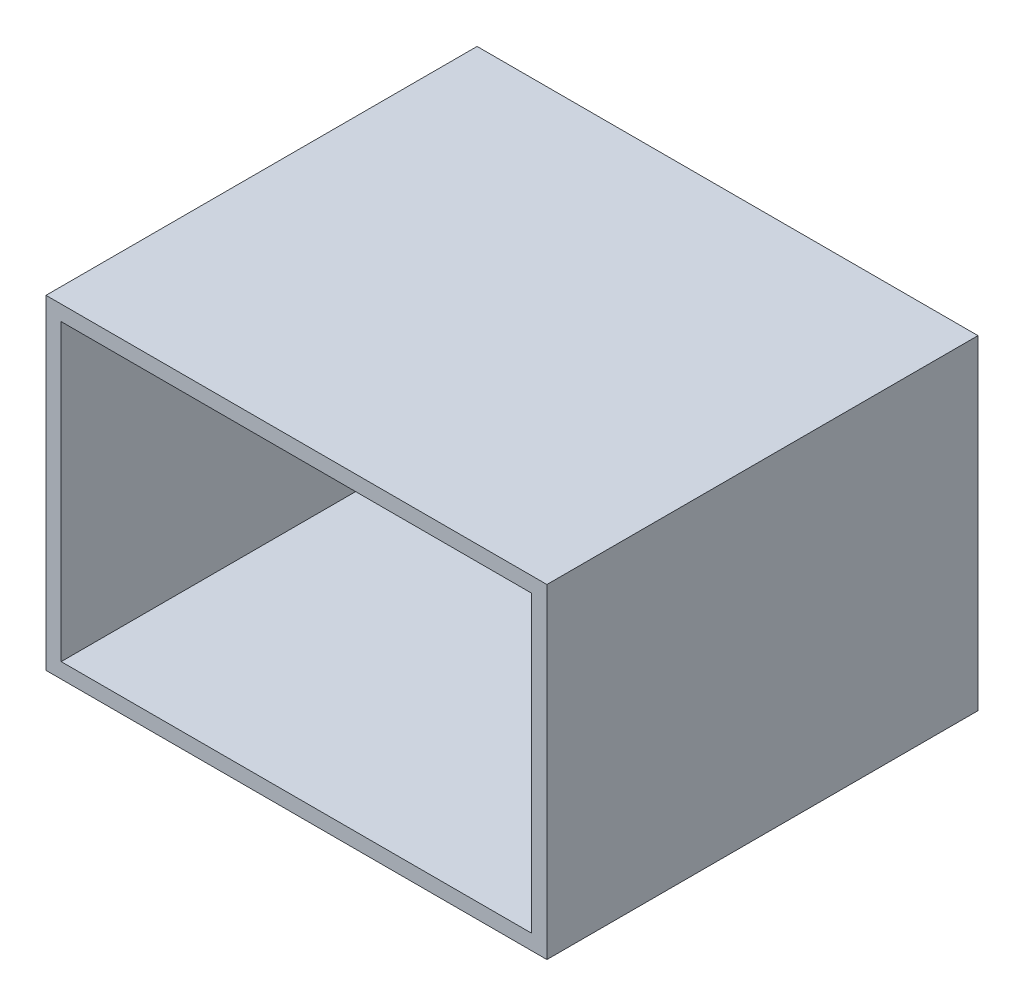
ISO-10303-21;
HEADER;
FILE_DESCRIPTION(('STEP AP214'),'2;1');
FILE_NAME('part.step','',(''),(''),'','','');
FILE_SCHEMA(('AUTOMOTIVE_DESIGN { 1 0 10303 214 1 1 1 1 }'));
ENDSEC;
DATA;
#1=APPLICATION_CONTEXT('core data for automotive mechanical design processes');
#2=APPLICATION_PROTOCOL_DEFINITION('international standard','automotive_design',2000,#1);
#3=PRODUCT_CONTEXT('',#1,'mechanical');
#4=PRODUCT('Part','Part','',(#3));
#5=PRODUCT_RELATED_PRODUCT_CATEGORY('part','',(#4));
#6=PRODUCT_DEFINITION_FORMATION('','',#4);
#7=PRODUCT_DEFINITION_CONTEXT('part definition',#1,'design');
#8=PRODUCT_DEFINITION('design','',#6,#7);
#9=PRODUCT_DEFINITION_SHAPE('','',#8);
#10=(LENGTH_UNIT() NAMED_UNIT(*) SI_UNIT(.MILLI.,.METRE.));
#11=(NAMED_UNIT(*) PLANE_ANGLE_UNIT() SI_UNIT($,.RADIAN.));
#12=(NAMED_UNIT(*) SI_UNIT($,.STERADIAN.) SOLID_ANGLE_UNIT());
#13=UNCERTAINTY_MEASURE_WITH_UNIT(LENGTH_MEASURE(1.E-05),#10,'distance_accuracy_value','');
#14=(GEOMETRIC_REPRESENTATION_CONTEXT(3) GLOBAL_UNCERTAINTY_ASSIGNED_CONTEXT((#13)) GLOBAL_UNIT_ASSIGNED_CONTEXT((#10,
#11,#12)) REPRESENTATION_CONTEXT('',''));
#15=CARTESIAN_POINT('',(0.,0.,0.));
#16=DIRECTION('',(0.,0.,1.));
#17=DIRECTION('',(1.,0.,0.));
#18=AXIS2_PLACEMENT_3D('',#15,#16,#17);
#19=CARTESIAN_POINT('',(0.,0.,142.));
#20=DIRECTION('',(0.,0.,1.));
#21=DIRECTION('',(1.,0.,0.));
#22=AXIS2_PLACEMENT_3D('',#19,#20,#21);
#23=PLANE('',#22);
#24=DIRECTION('',(0.,-1.,0.));
#25=VECTOR('',#24,1.);
#26=CARTESIAN_POINT('',(-82.5,53.5,142.));
#27=LINE('',#26,#25);
#28=CARTESIAN_POINT('',(-82.5,53.5,142.));
#29=VERTEX_POINT('',#28);
#30=CARTESIAN_POINT('',(-82.5,-53.5,142.));
#31=VERTEX_POINT('',#30);
#32=EDGE_CURVE('E140',#29,#31,#27,.T.);
#33=ORIENTED_EDGE('',*,*,#32,.T.);
#34=DIRECTION('',(1.,0.,0.));
#35=VECTOR('',#34,1.);
#36=CARTESIAN_POINT('',(-82.5,-53.5,142.));
#37=LINE('',#36,#35);
#38=CARTESIAN_POINT('',(82.5,-53.5,142.));
#39=VERTEX_POINT('',#38);
#40=EDGE_CURVE('E143',#31,#39,#37,.T.);
#41=ORIENTED_EDGE('',*,*,#40,.T.);
#42=DIRECTION('',(0.,1.,0.));
#43=VECTOR('',#42,1.);
#44=CARTESIAN_POINT('',(82.5,53.5,142.));
#45=LINE('',#44,#43);
#46=CARTESIAN_POINT('',(82.5,53.5,142.));
#47=VERTEX_POINT('',#46);
#48=EDGE_CURVE('E146',#39,#47,#45,.T.);
#49=ORIENTED_EDGE('',*,*,#48,.T.);
#50=DIRECTION('',(-1.,0.,0.));
#51=VECTOR('',#50,1.);
#52=CARTESIAN_POINT('',(-82.5,53.5,142.));
#53=LINE('',#52,#51);
#54=EDGE_CURVE('E148',#47,#29,#53,.T.);
#55=ORIENTED_EDGE('',*,*,#54,.T.);
#56=EDGE_LOOP('',(#33,#41,#49,#55));
#57=FACE_BOUND('',#56,.T.);
#58=DIRECTION('',(-1.,0.,0.));
#59=VECTOR('',#58,1.);
#60=CARTESIAN_POINT('',(-77.5,48.5,142.));
#61=LINE('',#60,#59);
#62=CARTESIAN_POINT('',(77.5,48.5,142.));
#63=VERTEX_POINT('',#62);
#64=CARTESIAN_POINT('',(-77.5,48.5,142.));
#65=VERTEX_POINT('',#64);
#66=EDGE_CURVE('E112',#63,#65,#61,.T.);
#67=ORIENTED_EDGE('',*,*,#66,.F.);
#68=DIRECTION('',(0.,1.,0.));
#69=VECTOR('',#68,1.);
#70=CARTESIAN_POINT('',(77.5,48.5,142.));
#71=LINE('',#70,#69);
#72=CARTESIAN_POINT('',(77.5,-48.5,142.));
#73=VERTEX_POINT('',#72);
#74=EDGE_CURVE('E104',#73,#63,#71,.T.);
#75=ORIENTED_EDGE('',*,*,#74,.F.);
#76=DIRECTION('',(1.,0.,0.));
#77=VECTOR('',#76,1.);
#78=CARTESIAN_POINT('',(-77.5,-48.5,142.));
#79=LINE('',#78,#77);
#80=CARTESIAN_POINT('',(-77.5,-48.5,142.));
#81=VERTEX_POINT('',#80);
#82=EDGE_CURVE('E126',#81,#73,#79,.T.);
#83=ORIENTED_EDGE('',*,*,#82,.F.);
#84=DIRECTION('',(0.,-1.,0.));
#85=VECTOR('',#84,1.);
#86=CARTESIAN_POINT('',(-77.5,48.5,142.));
#87=LINE('',#86,#85);
#88=EDGE_CURVE('E124',#65,#81,#87,.T.);
#89=ORIENTED_EDGE('',*,*,#88,.F.);
#90=EDGE_LOOP('',(#67,#75,#83,#89));
#91=FACE_BOUND('',#90,.T.);
#92=ADVANCED_FACE('F39',(#57,#91),#23,.T.);
#93=CARTESIAN_POINT('',(0.,0.,0.));
#94=DIRECTION('',(0.,0.,1.));
#95=DIRECTION('',(1.,0.,0.));
#96=AXIS2_PLACEMENT_3D('',#93,#94,#95);
#97=PLANE('',#96);
#98=DIRECTION('',(0.,-1.,0.));
#99=VECTOR('',#98,1.);
#100=CARTESIAN_POINT('',(-82.5,53.5,0.));
#101=LINE('',#100,#99);
#102=CARTESIAN_POINT('',(-82.5,53.5,0.));
#103=VERTEX_POINT('',#102);
#104=CARTESIAN_POINT('',(-82.5,-53.5,0.));
#105=VERTEX_POINT('',#104);
#106=EDGE_CURVE('E120',#103,#105,#101,.T.);
#107=ORIENTED_EDGE('',*,*,#106,.F.);
#108=DIRECTION('',(-1.,0.,0.));
#109=VECTOR('',#108,1.);
#110=CARTESIAN_POINT('',(-82.5,53.5,0.));
#111=LINE('',#110,#109);
#112=CARTESIAN_POINT('',(82.5,53.5,0.));
#113=VERTEX_POINT('',#112);
#114=EDGE_CURVE('E144',#113,#103,#111,.T.);
#115=ORIENTED_EDGE('',*,*,#114,.F.);
#116=DIRECTION('',(0.,1.,0.));
#117=VECTOR('',#116,1.);
#118=CARTESIAN_POINT('',(82.5,53.5,0.));
#119=LINE('',#118,#117);
#120=CARTESIAN_POINT('',(82.5,-53.5,0.));
#121=VERTEX_POINT('',#120);
#122=EDGE_CURVE('E155',#121,#113,#119,.T.);
#123=ORIENTED_EDGE('',*,*,#122,.F.);
#124=DIRECTION('',(1.,0.,0.));
#125=VECTOR('',#124,1.);
#126=CARTESIAN_POINT('',(-82.5,-53.5,0.));
#127=LINE('',#126,#125);
#128=EDGE_CURVE('E153',#105,#121,#127,.T.);
#129=ORIENTED_EDGE('',*,*,#128,.F.);
#130=EDGE_LOOP('',(#107,#115,#123,#129));
#131=FACE_BOUND('',#130,.T.);
#132=DIRECTION('',(0.,1.,0.));
#133=VECTOR('',#132,1.);
#134=CARTESIAN_POINT('',(77.5,48.5,0.));
#135=LINE('',#134,#133);
#136=CARTESIAN_POINT('',(77.5,-48.5,0.));
#137=VERTEX_POINT('',#136);
#138=CARTESIAN_POINT('',(77.5,48.5,0.));
#139=VERTEX_POINT('',#138);
#140=EDGE_CURVE('E62',#137,#139,#135,.T.);
#141=ORIENTED_EDGE('',*,*,#140,.T.);
#142=DIRECTION('',(-1.,0.,0.));
#143=VECTOR('',#142,1.);
#144=CARTESIAN_POINT('',(-77.5,48.5,0.));
#145=LINE('',#144,#143);
#146=CARTESIAN_POINT('',(-77.5,48.5,0.));
#147=VERTEX_POINT('',#146);
#148=EDGE_CURVE('E119',#139,#147,#145,.T.);
#149=ORIENTED_EDGE('',*,*,#148,.T.);
#150=DIRECTION('',(0.,-1.,0.));
#151=VECTOR('',#150,1.);
#152=CARTESIAN_POINT('',(-77.5,48.5,0.));
#153=LINE('',#152,#151);
#154=CARTESIAN_POINT('',(-77.5,-48.5,0.));
#155=VERTEX_POINT('',#154);
#156=EDGE_CURVE('E132',#147,#155,#153,.T.);
#157=ORIENTED_EDGE('',*,*,#156,.T.);
#158=DIRECTION('',(1.,0.,0.));
#159=VECTOR('',#158,1.);
#160=CARTESIAN_POINT('',(-77.5,-48.5,0.));
#161=LINE('',#160,#159);
#162=EDGE_CURVE('E113',#155,#137,#161,.T.);
#163=ORIENTED_EDGE('',*,*,#162,.T.);
#164=EDGE_LOOP('',(#141,#149,#157,#163));
#165=FACE_BOUND('',#164,.T.);
#166=ADVANCED_FACE('F173',(#131,#165),#97,.F.);
#167=CARTESIAN_POINT('',(-82.5,53.5,142.));
#168=DIRECTION('',(1.,0.,0.));
#169=DIRECTION('',(0.,1.,0.));
#170=AXIS2_PLACEMENT_3D('',#167,#168,#169);
#171=PLANE('',#170);
#172=ORIENTED_EDGE('',*,*,#106,.T.);
#173=DIRECTION('',(0.,0.,-1.));
#174=VECTOR('',#173,1.);
#175=CARTESIAN_POINT('',(-82.5,-53.5,142.));
#176=LINE('',#175,#174);
#177=EDGE_CURVE('E11',#31,#105,#176,.T.);
#178=ORIENTED_EDGE('',*,*,#177,.F.);
#179=ORIENTED_EDGE('',*,*,#32,.F.);
#180=DIRECTION('',(0.,0.,-1.));
#181=VECTOR('',#180,1.);
#182=CARTESIAN_POINT('',(-82.5,53.5,142.));
#183=LINE('',#182,#181);
#184=EDGE_CURVE('E150',#29,#103,#183,.T.);
#185=ORIENTED_EDGE('',*,*,#184,.T.);
#186=EDGE_LOOP('',(#172,#178,#179,#185));
#187=FACE_BOUND('',#186,.T.);
#188=ADVANCED_FACE('F41',(#187),#171,.F.);
#189=CARTESIAN_POINT('',(-82.5,-53.5,142.));
#190=DIRECTION('',(0.,1.,0.));
#191=DIRECTION('',(-1.,0.,0.));
#192=AXIS2_PLACEMENT_3D('',#189,#190,#191);
#193=PLANE('',#192);
#194=ORIENTED_EDGE('',*,*,#128,.T.);
#195=DIRECTION('',(0.,0.,-1.));
#196=VECTOR('',#195,1.);
#197=CARTESIAN_POINT('',(82.5,-53.5,142.));
#198=LINE('',#197,#196);
#199=EDGE_CURVE('E47',#39,#121,#198,.T.);
#200=ORIENTED_EDGE('',*,*,#199,.F.);
#201=ORIENTED_EDGE('',*,*,#40,.F.);
#202=ORIENTED_EDGE('',*,*,#177,.T.);
#203=EDGE_LOOP('',(#194,#200,#201,#202));
#204=FACE_BOUND('',#203,.T.);
#205=ADVANCED_FACE('F183',(#204),#193,.F.);
#206=CARTESIAN_POINT('',(82.5,53.5,142.));
#207=DIRECTION('',(-1.,0.,0.));
#208=DIRECTION('',(0.,0.,1.));
#209=AXIS2_PLACEMENT_3D('',#206,#207,#208);
#210=PLANE('',#209);
#211=ORIENTED_EDGE('',*,*,#122,.T.);
#212=DIRECTION('',(0.,0.,-1.));
#213=VECTOR('',#212,1.);
#214=CARTESIAN_POINT('',(82.5,53.5,142.));
#215=LINE('',#214,#213);
#216=EDGE_CURVE('E160',#47,#113,#215,.T.);
#217=ORIENTED_EDGE('',*,*,#216,.F.);
#218=ORIENTED_EDGE('',*,*,#48,.F.);
#219=ORIENTED_EDGE('',*,*,#199,.T.);
#220=EDGE_LOOP('',(#211,#217,#218,#219));
#221=FACE_BOUND('',#220,.T.);
#222=ADVANCED_FACE('F167',(#221),#210,.F.);
#223=CARTESIAN_POINT('',(-82.5,53.5,142.));
#224=DIRECTION('',(0.,-1.,0.));
#225=DIRECTION('',(0.,0.,-1.));
#226=AXIS2_PLACEMENT_3D('',#223,#224,#225);
#227=PLANE('',#226);
#228=ORIENTED_EDGE('',*,*,#114,.T.);
#229=ORIENTED_EDGE('',*,*,#184,.F.);
#230=ORIENTED_EDGE('',*,*,#54,.F.);
#231=ORIENTED_EDGE('',*,*,#216,.T.);
#232=EDGE_LOOP('',(#228,#229,#230,#231));
#233=FACE_BOUND('',#232,.T.);
#234=ADVANCED_FACE('F177',(#233),#227,.F.);
#235=CARTESIAN_POINT('',(77.5,48.5,142.));
#236=DIRECTION('',(-1.,0.,0.));
#237=DIRECTION('',(0.,0.,1.));
#238=AXIS2_PLACEMENT_3D('',#235,#236,#237);
#239=PLANE('',#238);
#240=ORIENTED_EDGE('',*,*,#140,.F.);
#241=DIRECTION('',(0.,0.,-1.));
#242=VECTOR('',#241,1.);
#243=CARTESIAN_POINT('',(77.5,-48.5,142.));
#244=LINE('',#243,#242);
#245=EDGE_CURVE('E108',#73,#137,#244,.T.);
#246=ORIENTED_EDGE('',*,*,#245,.F.);
#247=ORIENTED_EDGE('',*,*,#74,.T.);
#248=DIRECTION('',(0.,0.,-1.));
#249=VECTOR('',#248,1.);
#250=CARTESIAN_POINT('',(77.5,48.5,142.));
#251=LINE('',#250,#249);
#252=EDGE_CURVE('E107',#63,#139,#251,.T.);
#253=ORIENTED_EDGE('',*,*,#252,.T.);
#254=EDGE_LOOP('',(#240,#246,#247,#253));
#255=FACE_BOUND('',#254,.T.);
#256=ADVANCED_FACE('F106',(#255),#239,.T.);
#257=CARTESIAN_POINT('',(-77.5,48.5,142.));
#258=DIRECTION('',(0.,-1.,0.));
#259=DIRECTION('',(0.,0.,-1.));
#260=AXIS2_PLACEMENT_3D('',#257,#258,#259);
#261=PLANE('',#260);
#262=ORIENTED_EDGE('',*,*,#148,.F.);
#263=ORIENTED_EDGE('',*,*,#252,.F.);
#264=ORIENTED_EDGE('',*,*,#66,.T.);
#265=DIRECTION('',(0.,0.,-1.));
#266=VECTOR('',#265,1.);
#267=CARTESIAN_POINT('',(-77.5,48.5,142.));
#268=LINE('',#267,#266);
#269=EDGE_CURVE('E121',#65,#147,#268,.T.);
#270=ORIENTED_EDGE('',*,*,#269,.T.);
#271=EDGE_LOOP('',(#262,#263,#264,#270));
#272=FACE_BOUND('',#271,.T.);
#273=ADVANCED_FACE('F116',(#272),#261,.T.);
#274=CARTESIAN_POINT('',(-77.5,48.5,142.));
#275=DIRECTION('',(1.,0.,0.));
#276=DIRECTION('',(0.,0.,-1.));
#277=AXIS2_PLACEMENT_3D('',#274,#275,#276);
#278=PLANE('',#277);
#279=ORIENTED_EDGE('',*,*,#156,.F.);
#280=ORIENTED_EDGE('',*,*,#269,.F.);
#281=ORIENTED_EDGE('',*,*,#88,.T.);
#282=DIRECTION('',(0.,0.,-1.));
#283=VECTOR('',#282,1.);
#284=CARTESIAN_POINT('',(-77.5,-48.5,142.));
#285=LINE('',#284,#283);
#286=EDGE_CURVE('E54',#81,#155,#285,.T.);
#287=ORIENTED_EDGE('',*,*,#286,.T.);
#288=EDGE_LOOP('',(#279,#280,#281,#287));
#289=FACE_BOUND('',#288,.T.);
#290=ADVANCED_FACE('F206',(#289),#278,.T.);
#291=CARTESIAN_POINT('',(-77.5,-48.5,142.));
#292=DIRECTION('',(0.,1.,0.));
#293=DIRECTION('',(0.,0.,1.));
#294=AXIS2_PLACEMENT_3D('',#291,#292,#293);
#295=PLANE('',#294);
#296=ORIENTED_EDGE('',*,*,#162,.F.);
#297=ORIENTED_EDGE('',*,*,#286,.F.);
#298=ORIENTED_EDGE('',*,*,#82,.T.);
#299=ORIENTED_EDGE('',*,*,#245,.T.);
#300=EDGE_LOOP('',(#296,#297,#298,#299));
#301=FACE_BOUND('',#300,.T.);
#302=ADVANCED_FACE('F210',(#301),#295,.T.);
#303=CLOSED_SHELL('',(#92,#166,#188,#205,#222,#234,#256,#273,#290,#302));
#304=MANIFOLD_SOLID_BREP('B2',#303);
#305=ADVANCED_BREP_SHAPE_REPRESENTATION('',(#18,#304),#14);
#306=SHAPE_DEFINITION_REPRESENTATION(#9,#305);
ENDSEC;
END-ISO-10303-21;
